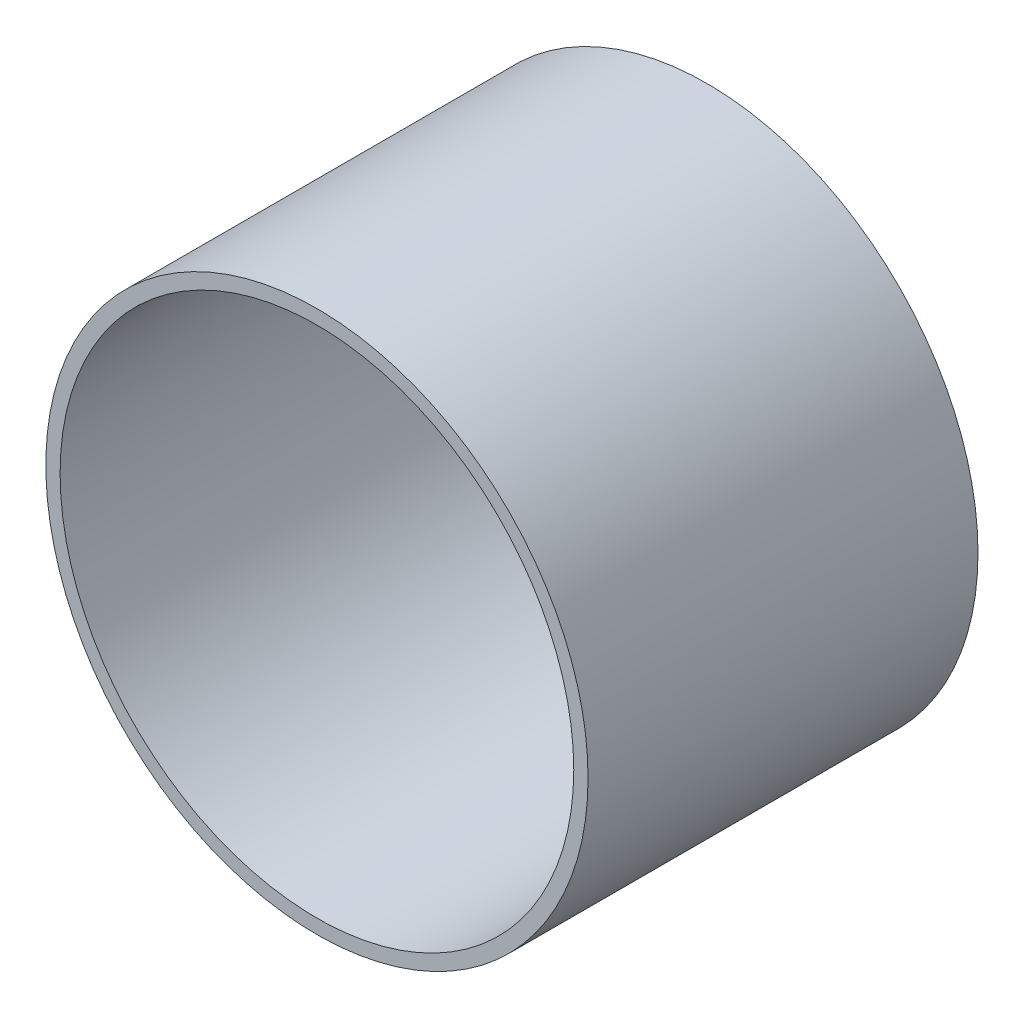
ISO-10303-21;
HEADER;
FILE_DESCRIPTION(('STEP AP214'),'2;1');
FILE_NAME('part.step','',(''),(''),'','','');
FILE_SCHEMA(('AUTOMOTIVE_DESIGN { 1 0 10303 214 1 1 1 1 }'));
ENDSEC;
DATA;
#1=APPLICATION_CONTEXT('core data for automotive mechanical design processes');
#2=APPLICATION_PROTOCOL_DEFINITION('international standard','automotive_design',2000,#1);
#3=PRODUCT_CONTEXT('',#1,'mechanical');
#4=PRODUCT('Part','Part','',(#3));
#5=PRODUCT_RELATED_PRODUCT_CATEGORY('part','',(#4));
#6=PRODUCT_DEFINITION_FORMATION('','',#4);
#7=PRODUCT_DEFINITION_CONTEXT('part definition',#1,'design');
#8=PRODUCT_DEFINITION('design','',#6,#7);
#9=PRODUCT_DEFINITION_SHAPE('','',#8);
#10=(LENGTH_UNIT() NAMED_UNIT(*) SI_UNIT(.MILLI.,.METRE.));
#11=(NAMED_UNIT(*) PLANE_ANGLE_UNIT() SI_UNIT($,.RADIAN.));
#12=(NAMED_UNIT(*) SI_UNIT($,.STERADIAN.) SOLID_ANGLE_UNIT());
#13=UNCERTAINTY_MEASURE_WITH_UNIT(LENGTH_MEASURE(1.E-05),#10,'distance_accuracy_value','');
#14=(GEOMETRIC_REPRESENTATION_CONTEXT(3) GLOBAL_UNCERTAINTY_ASSIGNED_CONTEXT((#13)) GLOBAL_UNIT_ASSIGNED_CONTEXT((#10,
#11,#12)) REPRESENTATION_CONTEXT('',''));
#15=CARTESIAN_POINT('',(0.,0.,0.));
#16=DIRECTION('',(0.,0.,1.));
#17=DIRECTION('',(1.,0.,0.));
#18=AXIS2_PLACEMENT_3D('',#15,#16,#17);
#19=CARTESIAN_POINT('',(0.,0.,41.1));
#20=DIRECTION('',(0.,0.,1.));
#21=DIRECTION('',(1.,0.,0.));
#22=AXIS2_PLACEMENT_3D('',#19,#20,#21);
#23=PLANE('',#22);
#24=CARTESIAN_POINT('',(0.,0.,41.1));
#25=DIRECTION('',(0.,0.,1.));
#26=DIRECTION('',(1.,0.,0.));
#27=AXIS2_PLACEMENT_3D('',#24,#25,#26);
#28=CIRCLE('',#27,57.15);
#29=CARTESIAN_POINT('',(57.15,0.,41.1));
#30=VERTEX_POINT('',#29);
#31=EDGE_CURVE('E11',#30,#30,#28,.T.);
#32=ORIENTED_EDGE('',*,*,#31,.T.);
#33=EDGE_LOOP('',(#32));
#34=FACE_BOUND('',#33,.T.);
#35=CARTESIAN_POINT('',(0.,0.,41.1));
#36=DIRECTION('',(0.,0.,1.));
#37=DIRECTION('',(1.,0.,0.));
#38=AXIS2_PLACEMENT_3D('',#35,#36,#37);
#39=CIRCLE('',#38,54.1401);
#40=CARTESIAN_POINT('',(54.1401,0.,41.1));
#41=VERTEX_POINT('',#40);
#42=EDGE_CURVE('E53',#41,#41,#39,.T.);
#43=ORIENTED_EDGE('',*,*,#42,.F.);
#44=EDGE_LOOP('',(#43));
#45=FACE_BOUND('',#44,.T.);
#46=ADVANCED_FACE('F43',(#34,#45),#23,.T.);
#47=CARTESIAN_POINT('',(0.,0.,-41.1));
#48=DIRECTION('',(0.,0.,1.));
#49=DIRECTION('',(1.,0.,0.));
#50=AXIS2_PLACEMENT_3D('',#47,#48,#49);
#51=PLANE('',#50);
#52=CARTESIAN_POINT('',(0.,0.,-41.1));
#53=DIRECTION('',(0.,0.,1.));
#54=DIRECTION('',(1.,0.,0.));
#55=AXIS2_PLACEMENT_3D('',#52,#53,#54);
#56=CIRCLE('',#55,57.15);
#57=CARTESIAN_POINT('',(57.15,0.,-41.1));
#58=VERTEX_POINT('',#57);
#59=EDGE_CURVE('E50',#58,#58,#56,.T.);
#60=ORIENTED_EDGE('',*,*,#59,.F.);
#61=EDGE_LOOP('',(#60));
#62=FACE_BOUND('',#61,.T.);
#63=CARTESIAN_POINT('',(0.,0.,-41.1));
#64=DIRECTION('',(0.,0.,1.));
#65=DIRECTION('',(1.,0.,0.));
#66=AXIS2_PLACEMENT_3D('',#63,#64,#65);
#67=CIRCLE('',#66,54.1401);
#68=CARTESIAN_POINT('',(54.1401,0.,-41.1));
#69=VERTEX_POINT('',#68);
#70=EDGE_CURVE('E57',#69,#69,#67,.T.);
#71=ORIENTED_EDGE('',*,*,#70,.T.);
#72=EDGE_LOOP('',(#71));
#73=FACE_BOUND('',#72,.T.);
#74=ADVANCED_FACE('F67',(#62,#73),#51,.F.);
#75=CARTESIAN_POINT('',(0.,0.,41.1));
#76=DIRECTION('',(0.,0.,-1.));
#77=DIRECTION('',(-1.,0.,0.));
#78=AXIS2_PLACEMENT_3D('',#75,#76,#77);
#79=CYLINDRICAL_SURFACE('',#78,57.15);
#80=ORIENTED_EDGE('',*,*,#31,.F.);
#81=EDGE_LOOP('',(#80));
#82=FACE_BOUND('',#81,.T.);
#83=ORIENTED_EDGE('',*,*,#59,.T.);
#84=EDGE_LOOP('',(#83));
#85=FACE_BOUND('',#84,.T.);
#86=ADVANCED_FACE('F44',(#82,#85),#79,.T.);
#87=CARTESIAN_POINT('',(0.,0.,41.1));
#88=DIRECTION('',(0.,0.,-1.));
#89=DIRECTION('',(-1.,0.,0.));
#90=AXIS2_PLACEMENT_3D('',#87,#88,#89);
#91=CYLINDRICAL_SURFACE('',#90,54.1401);
#92=ORIENTED_EDGE('',*,*,#42,.T.);
#93=EDGE_LOOP('',(#92));
#94=FACE_BOUND('',#93,.T.);
#95=ORIENTED_EDGE('',*,*,#70,.F.);
#96=EDGE_LOOP('',(#95));
#97=FACE_BOUND('',#96,.T.);
#98=ADVANCED_FACE('F64',(#94,#97),#91,.F.);
#99=CLOSED_SHELL('',(#46,#74,#86,#98));
#100=MANIFOLD_SOLID_BREP('B2',#99);
#101=ADVANCED_BREP_SHAPE_REPRESENTATION('',(#18,#100),#14);
#102=SHAPE_DEFINITION_REPRESENTATION(#9,#101);
ENDSEC;
END-ISO-10303-21;
